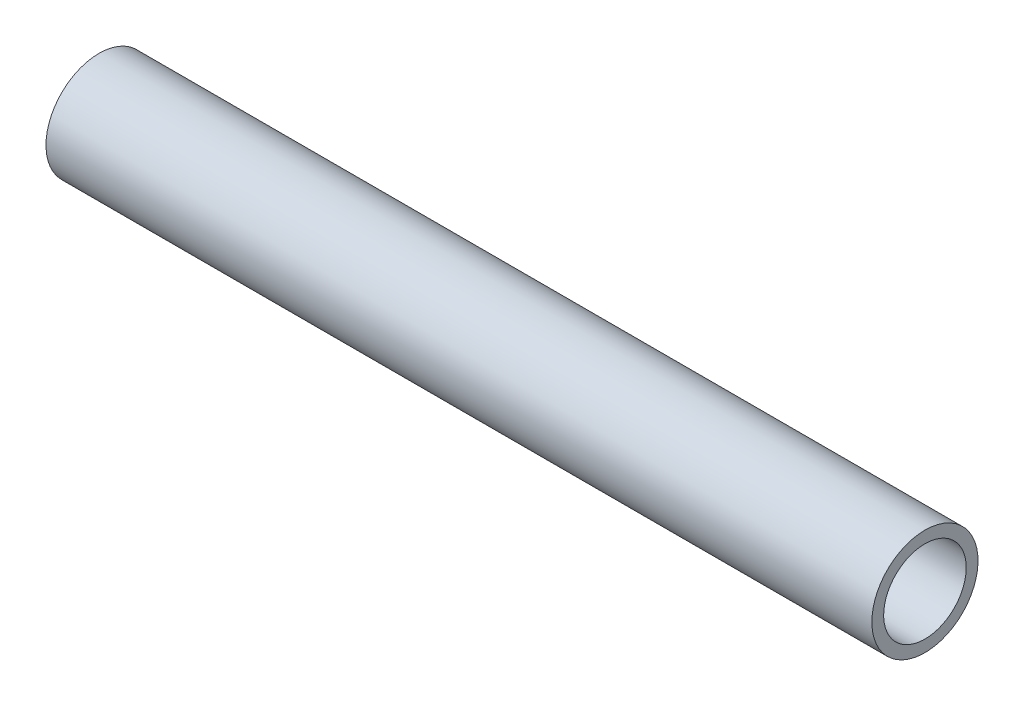
ISO-10303-21;
HEADER;
FILE_DESCRIPTION(('STEP AP214'),'2;1');
FILE_NAME('part.step','',(''),(''),'','','');
FILE_SCHEMA(('AUTOMOTIVE_DESIGN { 1 0 10303 214 1 1 1 1 }'));
ENDSEC;
DATA;
#1=APPLICATION_CONTEXT('core data for automotive mechanical design processes');
#2=APPLICATION_PROTOCOL_DEFINITION('international standard','automotive_design',2000,#1);
#3=PRODUCT_CONTEXT('',#1,'mechanical');
#4=PRODUCT('Part','Part','',(#3));
#5=PRODUCT_RELATED_PRODUCT_CATEGORY('part','',(#4));
#6=PRODUCT_DEFINITION_FORMATION('','',#4);
#7=PRODUCT_DEFINITION_CONTEXT('part definition',#1,'design');
#8=PRODUCT_DEFINITION('design','',#6,#7);
#9=PRODUCT_DEFINITION_SHAPE('','',#8);
#10=(LENGTH_UNIT() NAMED_UNIT(*) SI_UNIT(.MILLI.,.METRE.));
#11=(NAMED_UNIT(*) PLANE_ANGLE_UNIT() SI_UNIT($,.RADIAN.));
#12=(NAMED_UNIT(*) SI_UNIT($,.STERADIAN.) SOLID_ANGLE_UNIT());
#13=UNCERTAINTY_MEASURE_WITH_UNIT(LENGTH_MEASURE(1.E-05),#10,'distance_accuracy_value','');
#14=(GEOMETRIC_REPRESENTATION_CONTEXT(3) GLOBAL_UNCERTAINTY_ASSIGNED_CONTEXT((#13)) GLOBAL_UNIT_ASSIGNED_CONTEXT((#10,
#11,#12)) REPRESENTATION_CONTEXT('',''));
#15=CARTESIAN_POINT('',(0.,0.,0.));
#16=DIRECTION('',(0.,0.,1.));
#17=DIRECTION('',(1.,0.,0.));
#18=AXIS2_PLACEMENT_3D('',#15,#16,#17);
#19=CARTESIAN_POINT('',(0.,0.,0.));
#20=DIRECTION('',(-1.,0.,0.));
#21=DIRECTION('',(0.,0.,1.));
#22=AXIS2_PLACEMENT_3D('',#19,#20,#21);
#23=CYLINDRICAL_SURFACE('',#22,140.);
#24=CARTESIAN_POINT('',(1900.,0.,0.));
#25=DIRECTION('',(-1.,0.,0.));
#26=DIRECTION('',(0.,0.,1.));
#27=AXIS2_PLACEMENT_3D('',#24,#25,#26);
#28=CIRCLE('',#27,140.);
#29=CARTESIAN_POINT('',(1900.,140.,-1.00514204835565E-06));
#30=VERTEX_POINT('',#29);
#31=CARTESIAN_POINT('',(1900.,140.,0.));
#32=VERTEX_POINT('',#31);
#33=EDGE_CURVE('E11',#30,#32,#28,.T.);
#34=ORIENTED_EDGE('',*,*,#33,.T.);
#35=DIRECTION('',(1.,0.,0.));
#36=VECTOR('',#35,1.);
#37=CARTESIAN_POINT('',(4700.,140.,0.));
#38=LINE('',#37,#36);
#39=CARTESIAN_POINT('',(4700.,140.,0.));
#40=VERTEX_POINT('',#39);
#41=EDGE_CURVE('E100',#32,#40,#38,.T.);
#42=ORIENTED_EDGE('',*,*,#41,.T.);
#43=CARTESIAN_POINT('',(4700.,0.,0.));
#44=DIRECTION('',(-1.,0.,0.));
#45=DIRECTION('',(0.,0.,1.));
#46=AXIS2_PLACEMENT_3D('',#43,#44,#45);
#47=CIRCLE('',#46,140.);
#48=CARTESIAN_POINT('',(4700.,140.,-1.00514204835565E-06));
#49=VERTEX_POINT('',#48);
#50=EDGE_CURVE('E80',#49,#40,#47,.T.);
#51=ORIENTED_EDGE('',*,*,#50,.F.);
#52=DIRECTION('',(1.,0.,0.));
#53=VECTOR('',#52,1.);
#54=CARTESIAN_POINT('',(4700.,140.,-1.00514204835565E-06));
#55=LINE('',#54,#53);
#56=EDGE_CURVE('E103',#30,#49,#55,.T.);
#57=ORIENTED_EDGE('',*,*,#56,.F.);
#58=EDGE_LOOP('',(#34,#42,#51,#57));
#59=FACE_BOUND('',#58,.T.);
#60=ADVANCED_FACE('F39',(#59),#23,.F.);
#61=CARTESIAN_POINT('',(1900.,140.,-1.00514204835565E-06));
#62=DIRECTION('',(1.,0.,0.));
#63=DIRECTION('',(0.,0.,-1.));
#64=AXIS2_PLACEMENT_3D('',#61,#62,#63);
#65=PLANE('',#64);
#66=CARTESIAN_POINT('',(1900.,0.,0.));
#67=DIRECTION('',(-1.,0.,0.));
#68=DIRECTION('',(0.,0.,1.));
#69=AXIS2_PLACEMENT_3D('',#66,#67,#68);
#70=CIRCLE('',#69,180.);
#71=CARTESIAN_POINT('',(1900.,180.,-1.29232549074298E-06));
#72=VERTEX_POINT('',#71);
#73=CARTESIAN_POINT('',(1900.,180.,0.));
#74=VERTEX_POINT('',#73);
#75=EDGE_CURVE('E50',#72,#74,#70,.T.);
#76=ORIENTED_EDGE('',*,*,#75,.T.);
#77=DIRECTION('',(0.,-1.,0.));
#78=VECTOR('',#77,1.);
#79=CARTESIAN_POINT('',(1900.,140.,0.));
#80=LINE('',#79,#78);
#81=EDGE_CURVE('E104',#74,#32,#80,.T.);
#82=ORIENTED_EDGE('',*,*,#81,.T.);
#83=ORIENTED_EDGE('',*,*,#33,.F.);
#84=DIRECTION('',(0.,-1.,7.17958605968322E-09));
#85=VECTOR('',#84,1.);
#86=CARTESIAN_POINT('',(1900.,140.,-1.00514204835565E-06));
#87=LINE('',#86,#85);
#88=EDGE_CURVE('E91',#72,#30,#87,.T.);
#89=ORIENTED_EDGE('',*,*,#88,.F.);
#90=EDGE_LOOP('',(#76,#82,#83,#89));
#91=FACE_BOUND('',#90,.T.);
#92=ADVANCED_FACE('F41',(#91),#65,.F.);
#93=CARTESIAN_POINT('',(0.,0.,0.));
#94=DIRECTION('',(-1.,0.,0.));
#95=DIRECTION('',(0.,0.,1.));
#96=AXIS2_PLACEMENT_3D('',#93,#94,#95);
#97=CYLINDRICAL_SURFACE('',#96,180.);
#98=CARTESIAN_POINT('',(4700.,0.,0.));
#99=DIRECTION('',(-1.,0.,0.));
#100=DIRECTION('',(0.,0.,1.));
#101=AXIS2_PLACEMENT_3D('',#98,#99,#100);
#102=CIRCLE('',#101,180.);
#103=CARTESIAN_POINT('',(4700.,180.,-1.29232549074298E-06));
#104=VERTEX_POINT('',#103);
#105=CARTESIAN_POINT('',(4700.,180.,0.));
#106=VERTEX_POINT('',#105);
#107=EDGE_CURVE('E89',#104,#106,#102,.T.);
#108=ORIENTED_EDGE('',*,*,#107,.T.);
#109=DIRECTION('',(-1.,0.,0.));
#110=VECTOR('',#109,1.);
#111=CARTESIAN_POINT('',(1900.,180.,0.));
#112=LINE('',#111,#110);
#113=EDGE_CURVE('E97',#106,#74,#112,.T.);
#114=ORIENTED_EDGE('',*,*,#113,.T.);
#115=ORIENTED_EDGE('',*,*,#75,.F.);
#116=DIRECTION('',(-1.,0.,0.));
#117=VECTOR('',#116,1.);
#118=CARTESIAN_POINT('',(1900.,180.,-1.29232549074298E-06));
#119=LINE('',#118,#117);
#120=EDGE_CURVE('E109',#104,#72,#119,.T.);
#121=ORIENTED_EDGE('',*,*,#120,.F.);
#122=EDGE_LOOP('',(#108,#114,#115,#121));
#123=FACE_BOUND('',#122,.T.);
#124=ADVANCED_FACE('F112',(#123),#97,.T.);
#125=CARTESIAN_POINT('',(4700.,180.,-1.29232549074298E-06));
#126=DIRECTION('',(-1.,0.,0.));
#127=DIRECTION('',(0.,0.,1.));
#128=AXIS2_PLACEMENT_3D('',#125,#126,#127);
#129=PLANE('',#128);
#130=DIRECTION('',(0.,1.,-7.17958605968322E-09));
#131=VECTOR('',#130,1.);
#132=CARTESIAN_POINT('',(4700.,180.,-1.29232549074298E-06));
#133=LINE('',#132,#131);
#134=EDGE_CURVE('E82',#49,#104,#133,.T.);
#135=ORIENTED_EDGE('',*,*,#134,.F.);
#136=ORIENTED_EDGE('',*,*,#50,.T.);
#137=DIRECTION('',(0.,1.,0.));
#138=VECTOR('',#137,1.);
#139=CARTESIAN_POINT('',(4700.,180.,0.));
#140=LINE('',#139,#138);
#141=EDGE_CURVE('E85',#40,#106,#140,.T.);
#142=ORIENTED_EDGE('',*,*,#141,.T.);
#143=ORIENTED_EDGE('',*,*,#107,.F.);
#144=EDGE_LOOP('',(#135,#136,#142,#143));
#145=FACE_BOUND('',#144,.T.);
#146=ADVANCED_FACE('F83',(#145),#129,.F.);
#147=CARTESIAN_POINT('',(0.,0.,0.));
#148=DIRECTION('',(0.,-7.17958605968322E-09,-1.));
#149=DIRECTION('',(-1.,0.,0.));
#150=AXIS2_PLACEMENT_3D('',#147,#148,#149);
#151=PLANE('',#150);
#152=ORIENTED_EDGE('',*,*,#56,.T.);
#153=ORIENTED_EDGE('',*,*,#134,.T.);
#154=ORIENTED_EDGE('',*,*,#120,.T.);
#155=ORIENTED_EDGE('',*,*,#88,.T.);
#156=EDGE_LOOP('',(#152,#153,#154,#155));
#157=FACE_BOUND('',#156,.T.);
#158=ADVANCED_FACE('F111',(#157),#151,.F.);
#159=CARTESIAN_POINT('',(0.,0.,0.));
#160=DIRECTION('',(0.,0.,-1.));
#161=DIRECTION('',(-1.,0.,0.));
#162=AXIS2_PLACEMENT_3D('',#159,#160,#161);
#163=PLANE('',#162);
#164=ORIENTED_EDGE('',*,*,#41,.F.);
#165=ORIENTED_EDGE('',*,*,#81,.F.);
#166=ORIENTED_EDGE('',*,*,#113,.F.);
#167=ORIENTED_EDGE('',*,*,#141,.F.);
#168=EDGE_LOOP('',(#164,#165,#166,#167));
#169=FACE_BOUND('',#168,.T.);
#170=ADVANCED_FACE('F94',(#169),#163,.T.);
#171=CLOSED_SHELL('',(#60,#92,#124,#146,#158,#170));
#172=MANIFOLD_SOLID_BREP('B2',#171);
#173=ADVANCED_BREP_SHAPE_REPRESENTATION('',(#18,#172),#14);
#174=SHAPE_DEFINITION_REPRESENTATION(#9,#173);
ENDSEC;
END-ISO-10303-21;
